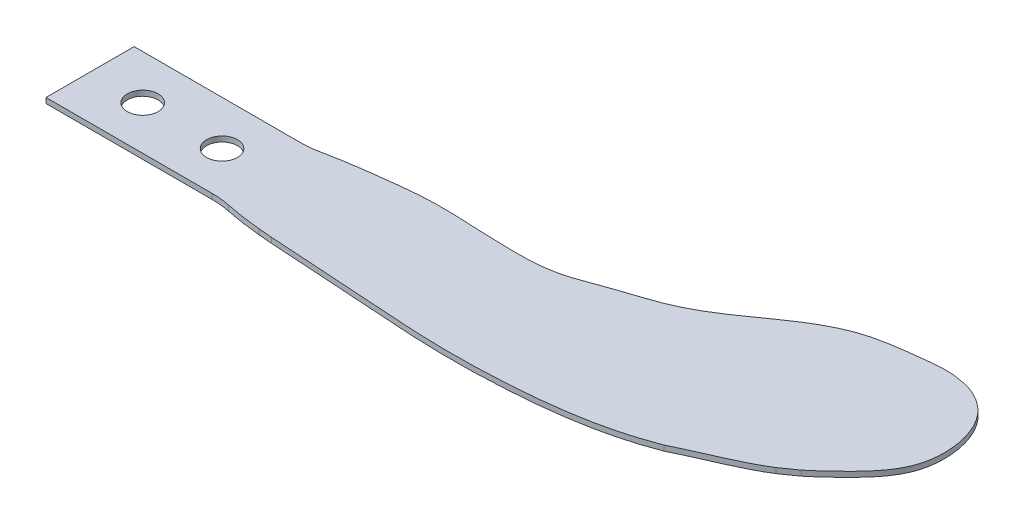
ISO-10303-21;
HEADER;
FILE_DESCRIPTION(('STEP AP214'),'2;1');
FILE_NAME('part.step','',(''),(''),'','','');
FILE_SCHEMA(('AUTOMOTIVE_DESIGN { 1 0 10303 214 1 1 1 1 }'));
ENDSEC;
DATA;
#1=APPLICATION_CONTEXT('core data for automotive mechanical design processes');
#2=APPLICATION_PROTOCOL_DEFINITION('international standard','automotive_design',2000,#1);
#3=PRODUCT_CONTEXT('',#1,'mechanical');
#4=PRODUCT('Part','Part','',(#3));
#5=PRODUCT_RELATED_PRODUCT_CATEGORY('part','',(#4));
#6=PRODUCT_DEFINITION_FORMATION('','',#4);
#7=PRODUCT_DEFINITION_CONTEXT('part definition',#1,'design');
#8=PRODUCT_DEFINITION('design','',#6,#7);
#9=PRODUCT_DEFINITION_SHAPE('','',#8);
#10=(LENGTH_UNIT() NAMED_UNIT(*) SI_UNIT(.MILLI.,.METRE.));
#11=(NAMED_UNIT(*) PLANE_ANGLE_UNIT() SI_UNIT($,.RADIAN.));
#12=(NAMED_UNIT(*) SI_UNIT($,.STERADIAN.) SOLID_ANGLE_UNIT());
#13=UNCERTAINTY_MEASURE_WITH_UNIT(LENGTH_MEASURE(1.E-05),#10,'distance_accuracy_value','');
#14=(GEOMETRIC_REPRESENTATION_CONTEXT(3) GLOBAL_UNCERTAINTY_ASSIGNED_CONTEXT((#13)) GLOBAL_UNIT_ASSIGNED_CONTEXT((#10,
#11,#12)) REPRESENTATION_CONTEXT('',''));
#15=CARTESIAN_POINT('',(0.,0.,0.));
#16=DIRECTION('',(0.,0.,1.));
#17=DIRECTION('',(1.,0.,0.));
#18=AXIS2_PLACEMENT_3D('',#15,#16,#17);
#19=CARTESIAN_POINT('',(61.6938429800198,-0.600000000000003,4.05910740886292));
#20=CARTESIAN_POINT('',(64.8026668773981,-0.6,2.50690764307333));
#21=CARTESIAN_POINT('',(69.7534318020435,-0.600000000000003,0.871467797706563));
#22=CARTESIAN_POINT('',(74.7745413929973,-0.6,-3.7529783722523));
#23=CARTESIAN_POINT('',(78.2236720765815,-0.600000000000003,-7.46428436941587));
#24=CARTESIAN_POINT('',(78.6157338115273,-0.600000000000003,-12.7720772232604));
#25=CARTESIAN_POINT('',(76.7495048197811,-0.599999999999996,-17.3108904955803));
#26=CARTESIAN_POINT('',(72.1044548495168,-0.6,-19.643512548254));
#27=CARTESIAN_POINT('',(67.1424145966671,-0.600000000000003,-19.0052573895129));
#28=CARTESIAN_POINT('',(62.1380162266281,-0.600000000000003,-18.3770275017326));
#29=CARTESIAN_POINT('',(57.6636447792491,-0.6,-16.1238831544614));
#30=CARTESIAN_POINT('',(53.5304999416177,-0.6,-13.0359798810454));
#31=CARTESIAN_POINT('',(48.790783239302,-0.600000000000003,-9.95664411151373));
#32=CARTESIAN_POINT('',(43.4989230581189,-0.6,-8.50361250610061));
#33=CARTESIAN_POINT('',(38.6653299406295,-0.600000000000003,-6.47195159489416));
#34=CARTESIAN_POINT('',(33.8734138204924,-0.600000000000007,-6.38295958469406));
#35=CARTESIAN_POINT('',(29.0208646525773,-0.6,-6.59787939815207));
#36=CARTESIAN_POINT('',(24.3456158567557,-0.600000000000003,-6.80159143115289));
#37=CARTESIAN_POINT('',(19.0487342937027,-0.600000000000007,-6.14307807486825));
#38=CARTESIAN_POINT('',(15.5340098970847,-0.6,-5.69593851551521));
#39=CARTESIAN_POINT('',(13.4721780973656,-0.600000000000003,-5.25393305049861));
#40=B_SPLINE_CURVE_WITH_KNOTS('',3,(#19,#20,#21,#22,#23,#24,#25,#26,#27,#28,#29,#30,#31,#32,#33,
#34,#35,#36,#37,#38,#39),.UNSPECIFIED.,.F.,.F.,(4,1,1,1,1,1,1,1,1,1,1,1,1,1,1,1,1,1,4),(0.,
0.0974642921306581,0.137999524964852,0.189052913166759,0.231454212882584,0.278046937109444,
0.315806508366648,0.365503135074344,0.41329860830154,0.454710288246978,0.501723778682879,
0.556359120756823,0.609108798668175,0.652642006451504,0.699907488376101,0.739412241100897,
0.787367277054301,0.828789936955284,0.886303433789127),.UNSPECIFIED.);
#41=DIRECTION('',(0.,1.,0.));
#42=VECTOR('',#41,1.);
#43=SURFACE_OF_LINEAR_EXTRUSION('',#40,#42);
#44=DIRECTION('',(0.,-1.,0.));
#45=VECTOR('',#44,1.);
#46=CARTESIAN_POINT('',(70.2729992676705,-0.3,-0.084874583708555));
#47=LINE('',#46,#45);
#48=CARTESIAN_POINT('',(70.2729992702973,0.,-0.0848745853521769));
#49=VERTEX_POINT('',#48);
#50=CARTESIAN_POINT('',(70.2729992676705,-0.6,-0.0848745837085559));
#51=VERTEX_POINT('',#50);
#52=EDGE_CURVE('E324',#49,#51,#47,.T.);
#53=ORIENTED_EDGE('',*,*,#52,.F.);
#54=CARTESIAN_POINT('',(61.6938429800198,0.,4.05910740886292));
#55=CARTESIAN_POINT('',(64.8026668773981,0.,2.50690764307333));
#56=CARTESIAN_POINT('',(69.7534318020435,0.,0.871467797706563));
#57=CARTESIAN_POINT('',(74.7745413929973,0.,-3.7529783722523));
#58=CARTESIAN_POINT('',(78.2236720765815,0.,-7.46428436941587));
#59=CARTESIAN_POINT('',(78.6157338115273,0.,-12.7720772232604));
#60=CARTESIAN_POINT('',(76.7495048197811,0.,-17.3108904955803));
#61=CARTESIAN_POINT('',(72.1044548495168,0.,-19.643512548254));
#62=CARTESIAN_POINT('',(67.1424145966671,0.,-19.0052573895129));
#63=CARTESIAN_POINT('',(62.1380162266281,0.,-18.3770275017326));
#64=CARTESIAN_POINT('',(57.6636447792491,0.,-16.1238831544614));
#65=CARTESIAN_POINT('',(53.5304999416177,0.,-13.0359798810454));
#66=CARTESIAN_POINT('',(48.790783239302,0.,-9.95664411151373));
#67=CARTESIAN_POINT('',(43.4989230581189,0.,-8.50361250610061));
#68=CARTESIAN_POINT('',(38.6653299406295,0.,-6.47195159489416));
#69=CARTESIAN_POINT('',(33.8734138204924,0.,-6.38295958469406));
#70=CARTESIAN_POINT('',(29.0208646525773,0.,-6.59787939815207));
#71=CARTESIAN_POINT('',(24.3456158567557,0.,-6.80159143115289));
#72=CARTESIAN_POINT('',(19.0487342937027,0.,-6.14307807486825));
#73=CARTESIAN_POINT('',(15.5340098970847,0.,-5.69593851551521));
#74=CARTESIAN_POINT('',(13.4721780973656,0.,-5.25393305049861));
#75=B_SPLINE_CURVE_WITH_KNOTS('',3,(#54,#55,#56,#57,#58,#59,#60,#61,#62,#63,#64,#65,#66,#67,#68,
#69,#70,#71,#72,#73,#74),.UNSPECIFIED.,.F.,.F.,(4,1,1,1,1,1,1,1,1,1,1,1,1,1,1,1,1,1,4),(0.,
0.0974642921306581,0.137999524964852,0.189052913166759,0.231454212882584,0.278046937109444,
0.315806508366648,0.365503135074344,0.41329860830154,0.454710288246978,0.501723778682879,
0.556359120756823,0.609108798668175,0.652642006451504,0.699907488376101,0.739412241100897,
0.787367277054301,0.828789936955284,0.886303433789127),.UNSPECIFIED.);
#76=CARTESIAN_POINT('',(61.6938429800198,0.,4.05910740886292));
#77=VERTEX_POINT('',#76);
#78=EDGE_CURVE('E270',#77,#49,#75,.T.);
#79=ORIENTED_EDGE('',*,*,#78,.F.);
#80=DIRECTION('',(0.,1.,0.));
#81=VECTOR('',#80,1.);
#82=CARTESIAN_POINT('',(61.6938429800198,-0.600000000000003,4.05910740886292));
#83=LINE('',#82,#81);
#84=CARTESIAN_POINT('',(61.6938429800198,-0.600000000000003,4.05910740886292));
#85=VERTEX_POINT('',#84);
#86=EDGE_CURVE('E262',#85,#77,#83,.T.);
#87=ORIENTED_EDGE('',*,*,#86,.F.);
#88=EDGE_CURVE('E287',#85,#51,#40,.T.);
#89=ORIENTED_EDGE('',*,*,#88,.T.);
#90=EDGE_LOOP('',(#53,#79,#87,#89));
#91=FACE_BOUND('',#90,.T.);
#92=ADVANCED_FACE('F80',(#91),#43,.T.);
#93=CARTESIAN_POINT('',(11.3587530999398,-0.600000000000003,14.968221972674));
#94=DIRECTION('',(0.,1.,0.));
#95=DIRECTION('',(0.,0.,1.));
#96=AXIS2_PLACEMENT_3D('',#93,#94,#95);
#97=PLANE('',#96);
#98=CARTESIAN_POINT('',(71.2729992682078,-0.6,-19.2517728008778));
#99=VERTEX_POINT('',#98);
#100=CARTESIAN_POINT('',(19.0041087625061,-0.6,-6.13468186883948));
#101=VERTEX_POINT('',#100);
#102=EDGE_CURVE('E293',#99,#101,#40,.T.);
#103=ORIENTED_EDGE('',*,*,#102,.F.);
#104=DIRECTION('',(0.985613784322148,0.,0.169013218874071));
#105=VECTOR('',#104,1.);
#106=CARTESIAN_POINT('',(71.2729992682077,-0.6,-19.2517728008778));
#107=LINE('',#106,#105);
#108=CARTESIAN_POINT('',(72.8890431268035,-0.6,-18.9746533259602));
#109=VERTEX_POINT('',#108);
#110=EDGE_CURVE('E460',#99,#109,#107,.T.);
#111=ORIENTED_EDGE('',*,*,#110,.T.);
#112=CARTESIAN_POINT('',(61.6938429800198,-0.6,4.05910740886292));
#113=CARTESIAN_POINT('',(64.8026668773981,-0.599999999999989,2.50690764307333));
#114=CARTESIAN_POINT('',(69.7534318020435,-0.599999999999993,0.871467797706563));
#115=CARTESIAN_POINT('',(74.7745413929973,-0.599999999999996,-3.7529783722523));
#116=CARTESIAN_POINT('',(78.2236720765815,-0.599999999999989,-7.46428436941587));
#117=CARTESIAN_POINT('',(78.6157338115273,-0.599999999999989,-12.7720772232604));
#118=CARTESIAN_POINT('',(76.7495048197811,-0.599999999999993,-17.3108904955803));
#119=CARTESIAN_POINT('',(72.1044548495168,-0.599999999999996,-19.643512548254));
#120=CARTESIAN_POINT('',(67.1424145966671,-0.599999999999989,-19.0052573895129));
#121=CARTESIAN_POINT('',(62.1380162266281,-0.599999999999989,-18.3770275017326));
#122=CARTESIAN_POINT('',(57.6636447792491,-0.599999999999993,-16.1238831544614));
#123=CARTESIAN_POINT('',(53.5304999416177,-0.6,-13.0359798810454));
#124=CARTESIAN_POINT('',(48.7907832393021,-0.599999999999993,-9.95664411151373));
#125=CARTESIAN_POINT('',(43.498923058119,-0.599999999999989,-8.50361250610061));
#126=CARTESIAN_POINT('',(38.6653299406296,-0.599999999999996,-6.47195159489416));
#127=CARTESIAN_POINT('',(33.8734138204924,-0.599999999999989,-6.38295958469406));
#128=CARTESIAN_POINT('',(29.0208646525773,-0.6,-6.59787939815207));
#129=CARTESIAN_POINT('',(24.3456158567557,-0.599999999999996,-6.80159143115289));
#130=CARTESIAN_POINT('',(19.0487342937027,-0.599999999999993,-6.14307807486825));
#131=CARTESIAN_POINT('',(15.5340098970847,-0.599999999999989,-5.69593851551521));
#132=CARTESIAN_POINT('',(13.4721780973656,-0.599999999999996,-5.25393305049861));
#133=B_SPLINE_CURVE_WITH_KNOTS('',3,(#112,#113,#114,#115,#116,#117,#118,#119,#120,#121,#122,
#123,#124,#125,#126,#127,#128,#129,#130,#131,#132),.UNSPECIFIED.,.F.,.F.,(4,1,1,1,1,1,1,1,1,1,1,
1,1,1,1,1,1,1,4),(0.,0.0974642921306581,0.137999524964852,0.189052913166759,0.231454212882584,
0.278046937109444,0.315806508366648,0.365503135074344,0.41329860830154,0.454710288246978,
0.501723778682879,0.556359120756823,0.609108798668175,0.652642006451504,0.699907488376101,
0.739412241100897,0.787367277054301,0.828789936955284,0.886303433789127),.UNSPECIFIED.);
#134=CARTESIAN_POINT('',(71.96591823374,-0.600000016073739,-1.28121163214526));
#135=VERTEX_POINT('',#134);
#136=EDGE_CURVE('E222',#135,#109,#133,.T.);
#137=ORIENTED_EDGE('',*,*,#136,.F.);
#138=DIRECTION('',(-0.816664240774609,0.,0.577113089298822));
#139=VECTOR('',#138,1.);
#140=CARTESIAN_POINT('',(71.9659181889099,-0.600000000000003,-1.28121160912084));
#141=LINE('',#140,#139);
#142=EDGE_CURVE('E303',#135,#51,#141,.T.);
#143=ORIENTED_EDGE('',*,*,#142,.T.);
#144=ORIENTED_EDGE('',*,*,#88,.F.);
#145=CARTESIAN_POINT('',(13.4384700926472,-0.600000000000003,5.18687353647954));
#146=CARTESIAN_POINT('',(14.701108677943,-0.600000000000003,5.45533661584096));
#147=CARTESIAN_POINT('',(18.0781645730451,-0.6,5.90762259363864));
#148=CARTESIAN_POINT('',(23.7272109064526,-0.600000000000003,6.19484272639975));
#149=CARTESIAN_POINT('',(30.6743375831285,-0.6,6.66145747400739));
#150=CARTESIAN_POINT('',(38.6993787811437,-0.6,7.24573238124021));
#151=CARTESIAN_POINT('',(49.2665108613436,-0.6,6.98259884214597));
#152=CARTESIAN_POINT('',(57.2028389027666,-0.600000000000003,5.81101987603051));
#153=CARTESIAN_POINT('',(61.6938429800198,-0.600000000000003,4.05910740886292));
#154=B_SPLINE_CURVE_WITH_KNOTS('',3,(#145,#146,#147,#148,#149,#150,#151,#152,#153),
.UNSPECIFIED.,.F.,.F.,(4,1,1,1,1,1,4),(0.178802379467905,0.244140319925647,0.350435716533196,
0.465443094241625,0.596636931396752,0.757598930507502,1.),.UNSPECIFIED.);
#155=CARTESIAN_POINT('',(19.0041087610566,-0.599999999999844,5.91414437599195));
#156=VERTEX_POINT('',#155);
#157=EDGE_CURVE('E268',#156,#85,#154,.T.);
#158=ORIENTED_EDGE('',*,*,#157,.F.);
#159=DIRECTION('',(-0.996156386943714,0.,-0.0875925382167046));
#160=VECTOR('',#159,1.);
#161=CARTESIAN_POINT('',(19.0041087625061,-0.6,5.91414437617128));
#162=LINE('',#161,#160);
#163=CARTESIAN_POINT('',(17.5024658713335,-0.6,5.78210415231002));
#164=VERTEX_POINT('',#163);
#165=EDGE_CURVE('E327',#156,#164,#162,.T.);
#166=ORIENTED_EDGE('',*,*,#165,.T.);
#167=CARTESIAN_POINT('',(13.4384700926472,-0.6,5.18687353647954));
#168=CARTESIAN_POINT('',(14.701108677943,-0.6,5.45533661584096));
#169=CARTESIAN_POINT('',(18.0781645730451,-0.6,5.90762259363864));
#170=CARTESIAN_POINT('',(23.7272109064526,-0.6,6.19484272639975));
#171=CARTESIAN_POINT('',(30.6743375831285,-0.6,6.66145747400739));
#172=CARTESIAN_POINT('',(38.6993787811437,-0.6,7.24573238124021));
#173=CARTESIAN_POINT('',(49.2665108613436,-0.6,6.98259884214597));
#174=CARTESIAN_POINT('',(57.2028389027666,-0.6,5.81101987603051));
#175=CARTESIAN_POINT('',(61.6938429800198,-0.6,4.05910740886292));
#176=B_SPLINE_CURVE_WITH_KNOTS('',3,(#167,#168,#169,#170,#171,#172,#173,#174,#175),
.UNSPECIFIED.,.F.,.F.,(4,1,1,1,1,1,4),(0.178802379467905,0.244140319925647,0.350435716533196,
0.465443094241625,0.596636931396752,0.757598930507502,1.),.UNSPECIFIED.);
#177=CARTESIAN_POINT('',(13.4384700926472,-0.6,5.18687353647953));
#178=VERTEX_POINT('',#177);
#179=EDGE_CURVE('E397',#178,#164,#176,.T.);
#180=ORIENTED_EDGE('',*,*,#179,.F.);
#181=CARTESIAN_POINT('',(11.3587530999398,-0.6,14.968221972674));
#182=DIRECTION('',(0.,-1.,0.));
#183=DIRECTION('',(0.,0.,1.));
#184=AXIS2_PLACEMENT_3D('',#181,#182,#183);
#185=CIRCLE('',#184,10.);
#186=CARTESIAN_POINT('',(11.3587530999398,-0.6,4.96822197267401));
#187=VERTEX_POINT('',#186);
#188=EDGE_CURVE('E509',#187,#178,#185,.T.);
#189=ORIENTED_EDGE('',*,*,#188,.F.);
#190=DIRECTION('',(1.,0.,0.));
#191=VECTOR('',#190,1.);
#192=CARTESIAN_POINT('',(-7.49753412866647,-0.6,4.968221972674));
#193=LINE('',#192,#191);
#194=CARTESIAN_POINT('',(-7.49753412866647,-0.6,4.968221972674));
#195=VERTEX_POINT('',#194);
#196=EDGE_CURVE('E514',#195,#187,#193,.T.);
#197=ORIENTED_EDGE('',*,*,#196,.F.);
#198=DIRECTION('',(0.,0.,1.));
#199=VECTOR('',#198,1.);
#200=CARTESIAN_POINT('',(-7.49753412866647,-0.6,-5.03177802732599));
#201=LINE('',#200,#199);
#202=CARTESIAN_POINT('',(-7.49753412866647,-0.6,-5.03177802732599));
#203=VERTEX_POINT('',#202);
#204=EDGE_CURVE('E519',#203,#195,#201,.T.);
#205=ORIENTED_EDGE('',*,*,#204,.F.);
#206=DIRECTION('',(-1.,0.,0.));
#207=VECTOR('',#206,1.);
#208=CARTESIAN_POINT('',(11.3760512860463,-0.6,-5.03177802732599));
#209=LINE('',#208,#207);
#210=CARTESIAN_POINT('',(11.3760512860463,-0.6,-5.03177802732599));
#211=VERTEX_POINT('',#210);
#212=EDGE_CURVE('E216',#211,#203,#209,.T.);
#213=ORIENTED_EDGE('',*,*,#212,.F.);
#214=CARTESIAN_POINT('',(11.3760512860463,-0.6,-15.031778027326));
#215=DIRECTION('',(0.,-1.,0.));
#216=DIRECTION('',(0.,0.,1.));
#217=AXIS2_PLACEMENT_3D('',#214,#215,#216);
#218=CIRCLE('',#217,10.);
#219=CARTESIAN_POINT('',(13.4721780973656,-0.6,-5.25393305049861));
#220=VERTEX_POINT('',#219);
#221=EDGE_CURVE('E206',#220,#211,#218,.T.);
#222=ORIENTED_EDGE('',*,*,#221,.F.);
#223=CARTESIAN_POINT('',(61.6938429800198,-0.6,4.05910740886292));
#224=CARTESIAN_POINT('',(64.8026668773981,-0.6,2.50690764307333));
#225=CARTESIAN_POINT('',(69.7534318020435,-0.6,0.871467797706563));
#226=CARTESIAN_POINT('',(74.7745413929973,-0.6,-3.7529783722523));
#227=CARTESIAN_POINT('',(78.2236720765815,-0.6,-7.46428436941587));
#228=CARTESIAN_POINT('',(78.6157338115273,-0.6,-12.7720772232604));
#229=CARTESIAN_POINT('',(76.7495048197811,-0.6,-17.3108904955803));
#230=CARTESIAN_POINT('',(72.1044548495168,-0.6,-19.643512548254));
#231=CARTESIAN_POINT('',(67.1424145966671,-0.6,-19.0052573895129));
#232=CARTESIAN_POINT('',(62.1380162266281,-0.6,-18.3770275017326));
#233=CARTESIAN_POINT('',(57.6636447792491,-0.6,-16.1238831544614));
#234=CARTESIAN_POINT('',(53.5304999416177,-0.6,-13.0359798810454));
#235=CARTESIAN_POINT('',(48.790783239302,-0.6,-9.95664411151374));
#236=CARTESIAN_POINT('',(43.4989230581189,-0.6,-8.50361250610061));
#237=CARTESIAN_POINT('',(38.6653299406295,-0.6,-6.47195159489416));
#238=CARTESIAN_POINT('',(33.8734138204924,-0.6,-6.38295958469406));
#239=CARTESIAN_POINT('',(29.0208646525773,-0.6,-6.59787939815207));
#240=CARTESIAN_POINT('',(24.3456158567557,-0.6,-6.80159143115289));
#241=CARTESIAN_POINT('',(19.0487342937027,-0.6,-6.14307807486825));
#242=CARTESIAN_POINT('',(15.5340098970847,-0.6,-5.69593851551521));
#243=CARTESIAN_POINT('',(13.4721780973656,-0.6,-5.25393305049861));
#244=B_SPLINE_CURVE_WITH_KNOTS('',3,(#223,#224,#225,#226,#227,#228,#229,#230,#231,#232,#233,
#234,#235,#236,#237,#238,#239,#240,#241,#242,#243),.UNSPECIFIED.,.F.,.F.,(4,1,1,1,1,1,1,1,1,1,1,
1,1,1,1,1,1,1,4),(0.,0.0974642921306581,0.137999524964852,0.189052913166759,0.231454212882584,
0.278046937109444,0.315806508366648,0.365503135074344,0.41329860830154,0.454710288246978,
0.501723778682879,0.556359120756823,0.609108798668175,0.652642006451504,0.699907488376101,
0.739412241100897,0.787367277054301,0.828789936955284,0.886303433789127),.UNSPECIFIED.);
#245=CARTESIAN_POINT('',(17.5024658764879,-0.6,-5.9379297845811));
#246=VERTEX_POINT('',#245);
#247=EDGE_CURVE('E190',#246,#220,#244,.T.);
#248=ORIENTED_EDGE('',*,*,#247,.F.);
#249=DIRECTION('',(0.991525246096983,0.,-0.129914149931086));
#250=VECTOR('',#249,1.);
#251=CARTESIAN_POINT('',(17.5024658713335,-0.6,-5.93792978363069));
#252=LINE('',#251,#250);
#253=EDGE_CURVE('E332',#246,#101,#252,.T.);
#254=ORIENTED_EDGE('',*,*,#253,.T.);
#255=EDGE_LOOP('',(#103,#111,#137,#143,#144,#158,#166,#180,#189,#197,#205,#213,#222,#248,#254));
#256=FACE_BOUND('',#255,.T.);
#257=CARTESIAN_POINT('',(-1.49753412866647,-0.600000000000003,0.));
#258=DIRECTION('',(0.,1.,0.));
#259=DIRECTION('',(0.,0.,1.));
#260=AXIS2_PLACEMENT_3D('',#257,#258,#259);
#261=CIRCLE('',#260,1.75);
#262=CARTESIAN_POINT('',(-1.49753412866647,-0.600000000000003,1.75));
#263=VERTEX_POINT('',#262);
#264=EDGE_CURVE('E498',#263,#263,#261,.T.);
#265=ORIENTED_EDGE('',*,*,#264,.T.);
#266=EDGE_LOOP('',(#265));
#267=FACE_BOUND('',#266,.T.);
#268=CARTESIAN_POINT('',(7.50246587133353,-0.600000000000003,0.));
#269=DIRECTION('',(0.,1.,0.));
#270=DIRECTION('',(0.,0.,1.));
#271=AXIS2_PLACEMENT_3D('',#268,#269,#270);
#272=CIRCLE('',#271,1.75);
#273=CARTESIAN_POINT('',(7.50246587133353,-0.600000000000003,1.75));
#274=VERTEX_POINT('',#273);
#275=EDGE_CURVE('E495',#274,#274,#272,.T.);
#276=ORIENTED_EDGE('',*,*,#275,.T.);
#277=EDGE_LOOP('',(#276));
#278=FACE_BOUND('',#277,.T.);
#279=ADVANCED_FACE('F212',(#256,#267,#278),#97,.F.);
#280=DIRECTION('',(0.,-1.,0.));
#281=VECTOR('',#280,1.);
#282=CARTESIAN_POINT('',(71.2729992682077,-0.299999999999998,-19.2517728008778));
#283=LINE('',#282,#281);
#284=CARTESIAN_POINT('',(71.2729992697666,0.,-19.2517728007569));
#285=VERTEX_POINT('',#284);
#286=EDGE_CURVE('E456',#285,#99,#283,.T.);
#287=ORIENTED_EDGE('',*,*,#286,.T.);
#288=ORIENTED_EDGE('',*,*,#102,.T.);
#289=CARTESIAN_POINT('',(19.0041087625055,-0.600000000000004,-6.13468186857222));
#290=DIRECTION('',(0.,1.,0.));
#291=VECTOR('',#290,1.);
#292=LINE('',#289,#291);
#293=CARTESIAN_POINT('',(19.0041087594835,0.,-6.13468186818912));
#294=VERTEX_POINT('',#293);
#295=EDGE_CURVE('E13',#294,#101,#292,.F.);
#296=ORIENTED_EDGE('',*,*,#295,.F.);
#297=EDGE_CURVE('E96',#285,#294,#75,.T.);
#298=ORIENTED_EDGE('',*,*,#297,.F.);
#299=EDGE_LOOP('',(#287,#288,#296,#298));
#300=FACE_BOUND('',#299,.T.);
#301=ADVANCED_FACE('F278',(#300),#43,.T.);
#302=CARTESIAN_POINT('',(11.3587530999398,0.,14.968221972674));
#303=DIRECTION('',(0.,1.,0.));
#304=DIRECTION('',(0.,0.,1.));
#305=AXIS2_PLACEMENT_3D('',#302,#303,#304);
#306=PLANE('',#305);
#307=ORIENTED_EDGE('',*,*,#78,.T.);
#308=DIRECTION('',(-0.816664240774609,0.,0.577113089298822));
#309=VECTOR('',#308,1.);
#310=CARTESIAN_POINT('',(71.9659181889099,0.,-1.28121160912084));
#311=LINE('',#310,#309);
#312=CARTESIAN_POINT('',(71.9659182055501,0.,-1.28121161941201));
#313=VERTEX_POINT('',#312);
#314=EDGE_CURVE('E459',#313,#49,#311,.T.);
#315=ORIENTED_EDGE('',*,*,#314,.F.);
#316=CARTESIAN_POINT('',(61.6938429800198,0.,4.05910740886292));
#317=CARTESIAN_POINT('',(64.8026668773981,0.,2.50690764307333));
#318=CARTESIAN_POINT('',(69.7534318020435,0.,0.871467797706561));
#319=CARTESIAN_POINT('',(74.7745413929973,0.,-3.7529783722523));
#320=CARTESIAN_POINT('',(78.2236720765815,0.,-7.46428436941587));
#321=CARTESIAN_POINT('',(78.6157338115273,0.,-12.7720772232604));
#322=CARTESIAN_POINT('',(76.7495048197811,0.,-17.3108904955803));
#323=CARTESIAN_POINT('',(72.1044548495168,0.,-19.643512548254));
#324=CARTESIAN_POINT('',(67.1424145966671,0.,-19.0052573895129));
#325=CARTESIAN_POINT('',(62.1380162266281,0.,-18.3770275017326));
#326=CARTESIAN_POINT('',(57.6636447792491,0.,-16.1238831544614));
#327=CARTESIAN_POINT('',(53.5304999416177,0.,-13.0359798810454));
#328=CARTESIAN_POINT('',(48.7907832393021,0.,-9.95664411151373));
#329=CARTESIAN_POINT('',(43.498923058119,0.,-8.50361250610061));
#330=CARTESIAN_POINT('',(38.6653299406296,0.,-6.47195159489416));
#331=CARTESIAN_POINT('',(33.8734138204924,0.,-6.38295958469406));
#332=CARTESIAN_POINT('',(29.0208646525773,0.,-6.59787939815207));
#333=CARTESIAN_POINT('',(24.3456158567557,0.,-6.80159143115289));
#334=CARTESIAN_POINT('',(19.0487342937028,0.,-6.14307807486825));
#335=CARTESIAN_POINT('',(15.5340098970847,0.,-5.69593851551521));
#336=CARTESIAN_POINT('',(13.4721780973656,0.,-5.25393305049861));
#337=B_SPLINE_CURVE_WITH_KNOTS('',3,(#316,#317,#318,#319,#320,#321,#322,#323,#324,#325,#326,
#327,#328,#329,#330,#331,#332,#333,#334,#335,#336),.UNSPECIFIED.,.F.,.F.,(4,1,1,1,1,1,1,1,1,1,1,
1,1,1,1,1,1,1,4),(0.,0.0974642921306581,0.137999524964852,0.189052913166759,0.231454212882584,
0.278046937109444,0.315806508366648,0.365503135074344,0.41329860830154,0.454710288246978,
0.501723778682879,0.556359120756823,0.609108798668175,0.652642006451504,0.699907488376101,
0.739412241100897,0.787367277054301,0.828789936955284,0.886303433789127),.UNSPECIFIED.);
#338=CARTESIAN_POINT('',(72.8890431427592,0.,-18.9746533232793));
#339=VERTEX_POINT('',#338);
#340=EDGE_CURVE('E228',#313,#339,#337,.T.);
#341=ORIENTED_EDGE('',*,*,#340,.T.);
#342=DIRECTION('',(0.985613784322148,0.,0.169013218874071));
#343=VECTOR('',#342,1.);
#344=CARTESIAN_POINT('',(71.2729992682077,0.,-19.2517728008778));
#345=LINE('',#344,#343);
#346=EDGE_CURVE('E461',#285,#339,#345,.T.);
#347=ORIENTED_EDGE('',*,*,#346,.F.);
#348=ORIENTED_EDGE('',*,*,#297,.T.);
#349=DIRECTION('',(0.991525246096983,0.,-0.129914149931086));
#350=VECTOR('',#349,1.);
#351=CARTESIAN_POINT('',(17.5024658713335,0.,-5.93792978363069));
#352=LINE('',#351,#350);
#353=CARTESIAN_POINT('',(17.5024658782431,0.,-5.93792978458109));
#354=VERTEX_POINT('',#353);
#355=EDGE_CURVE('E210',#354,#294,#352,.T.);
#356=ORIENTED_EDGE('',*,*,#355,.F.);
#357=CARTESIAN_POINT('',(61.6938429800198,0.,4.05910740886292));
#358=CARTESIAN_POINT('',(64.8026668773981,0.,2.50690764307333));
#359=CARTESIAN_POINT('',(69.7534318020435,0.,0.871467797706563));
#360=CARTESIAN_POINT('',(74.7745413929973,0.,-3.7529783722523));
#361=CARTESIAN_POINT('',(78.2236720765815,0.,-7.46428436941587));
#362=CARTESIAN_POINT('',(78.6157338115273,0.,-12.7720772232604));
#363=CARTESIAN_POINT('',(76.7495048197811,0.,-17.3108904955803));
#364=CARTESIAN_POINT('',(72.1044548495168,0.,-19.643512548254));
#365=CARTESIAN_POINT('',(67.1424145966671,0.,-19.0052573895129));
#366=CARTESIAN_POINT('',(62.1380162266281,0.,-18.3770275017326));
#367=CARTESIAN_POINT('',(57.6636447792491,0.,-16.1238831544614));
#368=CARTESIAN_POINT('',(53.5304999416177,0.,-13.0359798810454));
#369=CARTESIAN_POINT('',(48.790783239302,0.,-9.95664411151374));
#370=CARTESIAN_POINT('',(43.4989230581189,0.,-8.50361250610061));
#371=CARTESIAN_POINT('',(38.6653299406295,0.,-6.47195159489416));
#372=CARTESIAN_POINT('',(33.8734138204924,0.,-6.38295958469406));
#373=CARTESIAN_POINT('',(29.0208646525773,0.,-6.59787939815207));
#374=CARTESIAN_POINT('',(24.3456158567557,0.,-6.80159143115289));
#375=CARTESIAN_POINT('',(19.0487342937027,0.,-6.14307807486825));
#376=CARTESIAN_POINT('',(15.5340098970847,0.,-5.69593851551521));
#377=CARTESIAN_POINT('',(13.4721780973656,0.,-5.25393305049861));
#378=B_SPLINE_CURVE_WITH_KNOTS('',3,(#357,#358,#359,#360,#361,#362,#363,#364,#365,#366,#367,
#368,#369,#370,#371,#372,#373,#374,#375,#376,#377),.UNSPECIFIED.,.F.,.F.,(4,1,1,1,1,1,1,1,1,1,1,
1,1,1,1,1,1,1,4),(0.,0.0974642921306581,0.137999524964852,0.189052913166759,0.231454212882584,
0.278046937109444,0.315806508366648,0.365503135074344,0.41329860830154,0.454710288246978,
0.501723778682879,0.556359120756823,0.609108798668175,0.652642006451504,0.699907488376101,
0.739412241100897,0.787367277054301,0.828789936955284,0.886303433789127),.UNSPECIFIED.);
#379=CARTESIAN_POINT('',(13.4721780973656,0.,-5.25393305049861));
#380=VERTEX_POINT('',#379);
#381=EDGE_CURVE('E393',#354,#380,#378,.T.);
#382=ORIENTED_EDGE('',*,*,#381,.T.);
#383=CARTESIAN_POINT('',(11.3760512860463,0.,-15.031778027326));
#384=DIRECTION('',(0.,-1.,0.));
#385=DIRECTION('',(0.,0.,1.));
#386=AXIS2_PLACEMENT_3D('',#383,#384,#385);
#387=CIRCLE('',#386,10.);
#388=CARTESIAN_POINT('',(11.3760512860463,0.,-5.03177802732599));
#389=VERTEX_POINT('',#388);
#390=EDGE_CURVE('E209',#380,#389,#387,.T.);
#391=ORIENTED_EDGE('',*,*,#390,.T.);
#392=DIRECTION('',(-1.,0.,0.));
#393=VECTOR('',#392,1.);
#394=CARTESIAN_POINT('',(11.3760512860463,0.,-5.03177802732599));
#395=LINE('',#394,#393);
#396=CARTESIAN_POINT('',(-7.49753412866647,0.,-5.03177802732599));
#397=VERTEX_POINT('',#396);
#398=EDGE_CURVE('E476',#389,#397,#395,.T.);
#399=ORIENTED_EDGE('',*,*,#398,.T.);
#400=DIRECTION('',(0.,0.,1.));
#401=VECTOR('',#400,1.);
#402=CARTESIAN_POINT('',(-7.49753412866647,0.,-5.03177802732599));
#403=LINE('',#402,#401);
#404=CARTESIAN_POINT('',(-7.49753412866647,0.,4.968221972674));
#405=VERTEX_POINT('',#404);
#406=EDGE_CURVE('E525',#397,#405,#403,.T.);
#407=ORIENTED_EDGE('',*,*,#406,.T.);
#408=DIRECTION('',(1.,0.,0.));
#409=VECTOR('',#408,1.);
#410=CARTESIAN_POINT('',(-7.49753412866647,0.,4.968221972674));
#411=LINE('',#410,#409);
#412=CARTESIAN_POINT('',(11.3587530999398,0.,4.96822197267401));
#413=VERTEX_POINT('',#412);
#414=EDGE_CURVE('E526',#405,#413,#411,.T.);
#415=ORIENTED_EDGE('',*,*,#414,.T.);
#416=CARTESIAN_POINT('',(11.3587530999398,0.,14.968221972674));
#417=DIRECTION('',(0.,-1.,0.));
#418=DIRECTION('',(0.,0.,1.));
#419=AXIS2_PLACEMENT_3D('',#416,#417,#418);
#420=CIRCLE('',#419,10.);
#421=CARTESIAN_POINT('',(13.4384700926472,0.,5.18687353647953));
#422=VERTEX_POINT('',#421);
#423=EDGE_CURVE('E391',#413,#422,#420,.T.);
#424=ORIENTED_EDGE('',*,*,#423,.T.);
#425=CARTESIAN_POINT('',(13.4384700926472,0.,5.18687353647954));
#426=CARTESIAN_POINT('',(14.701108677943,0.,5.45533661584096));
#427=CARTESIAN_POINT('',(18.0781645730451,0.,5.90762259363864));
#428=CARTESIAN_POINT('',(23.7272109064526,0.,6.19484272639975));
#429=CARTESIAN_POINT('',(30.6743375831285,0.,6.66145747400739));
#430=CARTESIAN_POINT('',(38.6993787811437,0.,7.24573238124021));
#431=CARTESIAN_POINT('',(49.2665108613436,0.,6.98259884214597));
#432=CARTESIAN_POINT('',(57.2028389027666,0.,5.81101987603051));
#433=CARTESIAN_POINT('',(61.6938429800198,0.,4.05910740886292));
#434=B_SPLINE_CURVE_WITH_KNOTS('',3,(#425,#426,#427,#428,#429,#430,#431,#432,#433),
.UNSPECIFIED.,.F.,.F.,(4,1,1,1,1,1,4),(0.178802379467905,0.244140319925647,0.350435716533196,
0.465443094241625,0.596636931396752,0.757598930507502,1.),.UNSPECIFIED.);
#435=CARTESIAN_POINT('',(17.5024658737948,0.,5.7821041526146));
#436=VERTEX_POINT('',#435);
#437=EDGE_CURVE('E388',#422,#436,#434,.T.);
#438=ORIENTED_EDGE('',*,*,#437,.T.);
#439=DIRECTION('',(-0.996156386943714,0.,-0.0875925382167046));
#440=VECTOR('',#439,1.);
#441=CARTESIAN_POINT('',(19.0041087625061,0.,5.91414437617128));
#442=LINE('',#441,#440);
#443=CARTESIAN_POINT('',(19.0041087722601,0.,5.91414437675678));
#444=VERTEX_POINT('',#443);
#445=EDGE_CURVE('E335',#444,#436,#442,.T.);
#446=ORIENTED_EDGE('',*,*,#445,.F.);
#447=CARTESIAN_POINT('',(13.4384700926472,0.,5.18687353647954));
#448=CARTESIAN_POINT('',(14.701108677943,0.,5.45533661584096));
#449=CARTESIAN_POINT('',(18.0781645730451,0.,5.90762259363864));
#450=CARTESIAN_POINT('',(23.7272109064526,0.,6.19484272639975));
#451=CARTESIAN_POINT('',(30.6743375831285,0.,6.66145747400739));
#452=CARTESIAN_POINT('',(38.6993787811437,0.,7.24573238124021));
#453=CARTESIAN_POINT('',(49.2665108613436,0.,6.98259884214597));
#454=CARTESIAN_POINT('',(57.2028389027666,0.,5.81101987603051));
#455=CARTESIAN_POINT('',(61.6938429800198,0.,4.05910740886292));
#456=B_SPLINE_CURVE_WITH_KNOTS('',3,(#447,#448,#449,#450,#451,#452,#453,#454,#455),
.UNSPECIFIED.,.F.,.F.,(4,1,1,1,1,1,4),(0.178802379467905,0.244140319925647,0.350435716533196,
0.465443094241625,0.596636931396752,0.757598930507502,1.),.UNSPECIFIED.);
#457=EDGE_CURVE('E104',#444,#77,#456,.T.);
#458=ORIENTED_EDGE('',*,*,#457,.T.);
#459=EDGE_LOOP('',(#307,#315,#341,#347,#348,#356,#382,#391,#399,#407,#415,#424,#438,#446,#458));
#460=FACE_BOUND('',#459,.T.);
#461=CARTESIAN_POINT('',(-1.49753412866647,0.,0.));
#462=DIRECTION('',(0.,1.,0.));
#463=DIRECTION('',(0.,0.,1.));
#464=AXIS2_PLACEMENT_3D('',#461,#462,#463);
#465=CIRCLE('',#464,1.75);
#466=CARTESIAN_POINT('',(-1.49753412866647,0.,1.75));
#467=VERTEX_POINT('',#466);
#468=EDGE_CURVE('E501',#467,#467,#465,.T.);
#469=ORIENTED_EDGE('',*,*,#468,.F.);
#470=EDGE_LOOP('',(#469));
#471=FACE_BOUND('',#470,.T.);
#472=CARTESIAN_POINT('',(7.50246587133353,0.,0.));
#473=DIRECTION('',(0.,1.,0.));
#474=DIRECTION('',(0.,0.,1.));
#475=AXIS2_PLACEMENT_3D('',#472,#473,#474);
#476=CIRCLE('',#475,1.75);
#477=CARTESIAN_POINT('',(7.50246587133353,0.,1.75));
#478=VERTEX_POINT('',#477);
#479=EDGE_CURVE('E504',#478,#478,#476,.T.);
#480=ORIENTED_EDGE('',*,*,#479,.F.);
#481=EDGE_LOOP('',(#480));
#482=FACE_BOUND('',#481,.T.);
#483=ADVANCED_FACE('F82',(#460,#471,#482),#306,.T.);
#484=DIRECTION('',(0.,1.,0.));
#485=VECTOR('',#484,1.);
#486=SURFACE_OF_LINEAR_EXTRUSION('',#154,#485);
#487=CARTESIAN_POINT('',(19.0041087625059,0.,5.91414437599197));
#488=DIRECTION('',(0.,-1.,0.));
#489=VECTOR('',#488,1.);
#490=LINE('',#487,#489);
#491=EDGE_CURVE('E89',#444,#156,#490,.T.);
#492=ORIENTED_EDGE('',*,*,#491,.T.);
#493=ORIENTED_EDGE('',*,*,#157,.T.);
#494=ORIENTED_EDGE('',*,*,#86,.T.);
#495=ORIENTED_EDGE('',*,*,#457,.F.);
#496=EDGE_LOOP('',(#492,#493,#494,#495));
#497=FACE_BOUND('',#496,.T.);
#498=ADVANCED_FACE('F249',(#497),#486,.T.);
#499=CARTESIAN_POINT('',(71.2729992682077,-0.299999999999998,-19.2517728008778));
#500=DIRECTION('',(0.169013218874071,0.,-0.985613784322148));
#501=DIRECTION('',(0.985613784322148,0.,0.169013218874071));
#502=AXIS2_PLACEMENT_3D('',#499,#500,#501);
#503=PLANE('',#502);
#504=ORIENTED_EDGE('',*,*,#286,.F.);
#505=ORIENTED_EDGE('',*,*,#346,.T.);
#506=DIRECTION('',(0.,-1.,0.));
#507=VECTOR('',#506,1.);
#508=CARTESIAN_POINT('',(72.8890431268035,-0.3,-18.9746533259602));
#509=LINE('',#508,#507);
#510=EDGE_CURVE('E227',#339,#109,#509,.T.);
#511=ORIENTED_EDGE('',*,*,#510,.T.);
#512=ORIENTED_EDGE('',*,*,#110,.F.);
#513=EDGE_LOOP('',(#504,#505,#511,#512));
#514=FACE_BOUND('',#513,.T.);
#515=ADVANCED_FACE('F246',(#514),#503,.T.);
#516=CARTESIAN_POINT('',(71.9659181889099,-0.300000000000002,-1.28121160912084));
#517=DIRECTION('',(0.577113089298823,0.,0.81666424077461));
#518=DIRECTION('',(-0.816664240774609,0.,0.577113089298822));
#519=AXIS2_PLACEMENT_3D('',#516,#517,#518);
#520=PLANE('',#519);
#521=ORIENTED_EDGE('',*,*,#314,.T.);
#522=ORIENTED_EDGE('',*,*,#52,.T.);
#523=ORIENTED_EDGE('',*,*,#142,.F.);
#524=DIRECTION('',(0.,-1.,0.));
#525=VECTOR('',#524,1.);
#526=CARTESIAN_POINT('',(71.9659181889099,-0.300000000000002,-1.28121160912083));
#527=LINE('',#526,#525);
#528=EDGE_CURVE('E84',#313,#135,#527,.T.);
#529=ORIENTED_EDGE('',*,*,#528,.F.);
#530=EDGE_LOOP('',(#521,#522,#523,#529));
#531=FACE_BOUND('',#530,.T.);
#532=ADVANCED_FACE('F241',(#531),#520,.T.);
#533=DIRECTION('',(0.,1.,0.));
#534=VECTOR('',#533,1.);
#535=SURFACE_OF_LINEAR_EXTRUSION('',#133,#534);
#536=ORIENTED_EDGE('',*,*,#340,.F.);
#537=ORIENTED_EDGE('',*,*,#528,.T.);
#538=ORIENTED_EDGE('',*,*,#136,.T.);
#539=ORIENTED_EDGE('',*,*,#510,.F.);
#540=EDGE_LOOP('',(#536,#537,#538,#539));
#541=FACE_BOUND('',#540,.T.);
#542=ADVANCED_FACE('F236',(#541),#535,.T.);
#543=CARTESIAN_POINT('',(17.5024658713335,-0.3,-5.93792978363069));
#544=DIRECTION('',(-0.129914149931086,0.,-0.991525246096984));
#545=DIRECTION('',(0.991525246096983,0.,-0.129914149931086));
#546=AXIS2_PLACEMENT_3D('',#543,#544,#545);
#547=PLANE('',#546);
#548=CARTESIAN_POINT('',(17.5024658713335,0.,-5.93792978372478));
#549=DIRECTION('',(0.,-1.,0.));
#550=VECTOR('',#549,1.);
#551=LINE('',#548,#550);
#552=EDGE_CURVE('E196',#354,#246,#551,.T.);
#553=ORIENTED_EDGE('',*,*,#552,.F.);
#554=ORIENTED_EDGE('',*,*,#355,.T.);
#555=ORIENTED_EDGE('',*,*,#295,.T.);
#556=ORIENTED_EDGE('',*,*,#253,.F.);
#557=EDGE_LOOP('',(#553,#554,#555,#556));
#558=FACE_BOUND('',#557,.T.);
#559=ADVANCED_FACE('F240',(#558),#547,.T.);
#560=CARTESIAN_POINT('',(19.0041087625061,-0.3,5.91414437617128));
#561=DIRECTION('',(-0.0875925382167046,0.,0.996156386943714));
#562=DIRECTION('',(-0.996156386943714,0.,-0.0875925382167046));
#563=AXIS2_PLACEMENT_3D('',#560,#561,#562);
#564=PLANE('',#563);
#565=ORIENTED_EDGE('',*,*,#445,.T.);
#566=CARTESIAN_POINT('',(17.5024658713335,-0.6,5.78210415237194));
#567=DIRECTION('',(0.,1.,0.));
#568=VECTOR('',#567,1.);
#569=LINE('',#566,#568);
#570=EDGE_CURVE('E329',#436,#164,#569,.F.);
#571=ORIENTED_EDGE('',*,*,#570,.T.);
#572=ORIENTED_EDGE('',*,*,#165,.F.);
#573=ORIENTED_EDGE('',*,*,#491,.F.);
#574=EDGE_LOOP('',(#565,#571,#572,#573));
#575=FACE_BOUND('',#574,.T.);
#576=ADVANCED_FACE('F243',(#575),#564,.T.);
#577=CARTESIAN_POINT('',(11.3760512860463,-0.6,-15.031778027326));
#578=DIRECTION('',(0.,1.,0.));
#579=DIRECTION('',(0.,0.,1.));
#580=AXIS2_PLACEMENT_3D('',#577,#578,#579);
#581=CYLINDRICAL_SURFACE('',#580,10.);
#582=ORIENTED_EDGE('',*,*,#390,.F.);
#583=DIRECTION('',(0.,1.,0.));
#584=VECTOR('',#583,1.);
#585=CARTESIAN_POINT('',(13.4721780973656,-0.6,-5.25393305049861));
#586=LINE('',#585,#584);
#587=EDGE_CURVE('E193',#220,#380,#586,.T.);
#588=ORIENTED_EDGE('',*,*,#587,.F.);
#589=ORIENTED_EDGE('',*,*,#221,.T.);
#590=DIRECTION('',(0.,1.,0.));
#591=VECTOR('',#590,1.);
#592=CARTESIAN_POINT('',(11.3760512860463,-0.6,-5.03177802732599));
#593=LINE('',#592,#591);
#594=EDGE_CURVE('E217',#211,#389,#593,.T.);
#595=ORIENTED_EDGE('',*,*,#594,.T.);
#596=EDGE_LOOP('',(#582,#588,#589,#595));
#597=FACE_BOUND('',#596,.T.);
#598=ADVANCED_FACE('F205',(#597),#581,.F.);
#599=CARTESIAN_POINT('',(11.3760512860463,-0.6,-5.03177802732599));
#600=DIRECTION('',(0.,0.,-1.));
#601=DIRECTION('',(-1.,0.,0.));
#602=AXIS2_PLACEMENT_3D('',#599,#600,#601);
#603=PLANE('',#602);
#604=ORIENTED_EDGE('',*,*,#398,.F.);
#605=ORIENTED_EDGE('',*,*,#594,.F.);
#606=ORIENTED_EDGE('',*,*,#212,.T.);
#607=DIRECTION('',(0.,1.,0.));
#608=VECTOR('',#607,1.);
#609=CARTESIAN_POINT('',(-7.49753412866647,-0.6,-5.03177802732599));
#610=LINE('',#609,#608);
#611=EDGE_CURVE('E522',#203,#397,#610,.T.);
#612=ORIENTED_EDGE('',*,*,#611,.T.);
#613=EDGE_LOOP('',(#604,#605,#606,#612));
#614=FACE_BOUND('',#613,.T.);
#615=ADVANCED_FACE('F435',(#614),#603,.T.);
#616=CARTESIAN_POINT('',(-7.49753412866647,-0.6,-5.03177802732599));
#617=DIRECTION('',(-1.,0.,0.));
#618=DIRECTION('',(0.,0.,1.));
#619=AXIS2_PLACEMENT_3D('',#616,#617,#618);
#620=PLANE('',#619);
#621=ORIENTED_EDGE('',*,*,#406,.F.);
#622=ORIENTED_EDGE('',*,*,#611,.F.);
#623=ORIENTED_EDGE('',*,*,#204,.T.);
#624=DIRECTION('',(0.,1.,0.));
#625=VECTOR('',#624,1.);
#626=CARTESIAN_POINT('',(-7.49753412866647,-0.6,4.968221972674));
#627=LINE('',#626,#625);
#628=EDGE_CURVE('E517',#195,#405,#627,.T.);
#629=ORIENTED_EDGE('',*,*,#628,.T.);
#630=EDGE_LOOP('',(#621,#622,#623,#629));
#631=FACE_BOUND('',#630,.T.);
#632=ADVANCED_FACE('F431',(#631),#620,.T.);
#633=CARTESIAN_POINT('',(-7.49753412866647,-0.6,4.968221972674));
#634=DIRECTION('',(0.,0.,1.));
#635=DIRECTION('',(1.,0.,0.));
#636=AXIS2_PLACEMENT_3D('',#633,#634,#635);
#637=PLANE('',#636);
#638=ORIENTED_EDGE('',*,*,#414,.F.);
#639=ORIENTED_EDGE('',*,*,#628,.F.);
#640=ORIENTED_EDGE('',*,*,#196,.T.);
#641=DIRECTION('',(0.,1.,0.));
#642=VECTOR('',#641,1.);
#643=CARTESIAN_POINT('',(11.3587530999398,-0.6,4.96822197267401));
#644=LINE('',#643,#642);
#645=EDGE_CURVE('E512',#187,#413,#644,.T.);
#646=ORIENTED_EDGE('',*,*,#645,.T.);
#647=EDGE_LOOP('',(#638,#639,#640,#646));
#648=FACE_BOUND('',#647,.T.);
#649=ADVANCED_FACE('F427',(#648),#637,.T.);
#650=CARTESIAN_POINT('',(11.3587530999398,-0.6,14.968221972674));
#651=DIRECTION('',(0.,1.,0.));
#652=DIRECTION('',(0.,0.,1.));
#653=AXIS2_PLACEMENT_3D('',#650,#651,#652);
#654=CYLINDRICAL_SURFACE('',#653,10.);
#655=ORIENTED_EDGE('',*,*,#423,.F.);
#656=ORIENTED_EDGE('',*,*,#645,.F.);
#657=ORIENTED_EDGE('',*,*,#188,.T.);
#658=DIRECTION('',(0.,1.,0.));
#659=VECTOR('',#658,1.);
#660=CARTESIAN_POINT('',(13.4384700926472,-0.6,5.18687353647953));
#661=LINE('',#660,#659);
#662=EDGE_CURVE('E507',#178,#422,#661,.T.);
#663=ORIENTED_EDGE('',*,*,#662,.T.);
#664=EDGE_LOOP('',(#655,#656,#657,#663));
#665=FACE_BOUND('',#664,.T.);
#666=ADVANCED_FACE('F423',(#665),#654,.F.);
#667=CARTESIAN_POINT('',(7.50246587133353,-54.962239200225,0.));
#668=DIRECTION('',(0.,1.,0.));
#669=DIRECTION('',(0.,0.,1.));
#670=AXIS2_PLACEMENT_3D('',#667,#668,#669);
#671=CYLINDRICAL_SURFACE('',#670,1.75);
#672=ORIENTED_EDGE('',*,*,#479,.T.);
#673=EDGE_LOOP('',(#672));
#674=FACE_BOUND('',#673,.T.);
#675=ORIENTED_EDGE('',*,*,#275,.F.);
#676=EDGE_LOOP('',(#675));
#677=FACE_BOUND('',#676,.T.);
#678=ADVANCED_FACE('F419',(#674,#677),#671,.F.);
#679=CARTESIAN_POINT('',(-1.49753412866647,-54.962239200225,0.));
#680=DIRECTION('',(0.,1.,0.));
#681=DIRECTION('',(0.,0.,1.));
#682=AXIS2_PLACEMENT_3D('',#679,#680,#681);
#683=CYLINDRICAL_SURFACE('',#682,1.75);
#684=ORIENTED_EDGE('',*,*,#468,.T.);
#685=EDGE_LOOP('',(#684));
#686=FACE_BOUND('',#685,.T.);
#687=ORIENTED_EDGE('',*,*,#264,.F.);
#688=EDGE_LOOP('',(#687));
#689=FACE_BOUND('',#688,.T.);
#690=ADVANCED_FACE('F416',(#686,#689),#683,.F.);
#691=DIRECTION('',(0.,1.,0.));
#692=VECTOR('',#691,1.);
#693=SURFACE_OF_LINEAR_EXTRUSION('',#176,#692);
#694=ORIENTED_EDGE('',*,*,#179,.T.);
#695=ORIENTED_EDGE('',*,*,#570,.F.);
#696=ORIENTED_EDGE('',*,*,#437,.F.);
#697=ORIENTED_EDGE('',*,*,#662,.F.);
#698=EDGE_LOOP('',(#694,#695,#696,#697));
#699=FACE_BOUND('',#698,.T.);
#700=ADVANCED_FACE('F396',(#699),#693,.T.);
#701=DIRECTION('',(0.,1.,0.));
#702=VECTOR('',#701,1.);
#703=SURFACE_OF_LINEAR_EXTRUSION('',#244,#702);
#704=ORIENTED_EDGE('',*,*,#381,.F.);
#705=ORIENTED_EDGE('',*,*,#552,.T.);
#706=ORIENTED_EDGE('',*,*,#247,.T.);
#707=ORIENTED_EDGE('',*,*,#587,.T.);
#708=EDGE_LOOP('',(#704,#705,#706,#707));
#709=FACE_BOUND('',#708,.T.);
#710=ADVANCED_FACE('F192',(#709),#703,.T.);
#711=CLOSED_SHELL('',(#92,#279,#301,#483,#498,#515,#532,#542,#559,#576,#598,#615,#632,#649,#666,
#678,#690,#700,#710));
#712=MANIFOLD_SOLID_BREP('B2',#711);
#713=ADVANCED_BREP_SHAPE_REPRESENTATION('',(#18,#712),#14);
#714=SHAPE_DEFINITION_REPRESENTATION(#9,#713);
ENDSEC;
END-ISO-10303-21;
